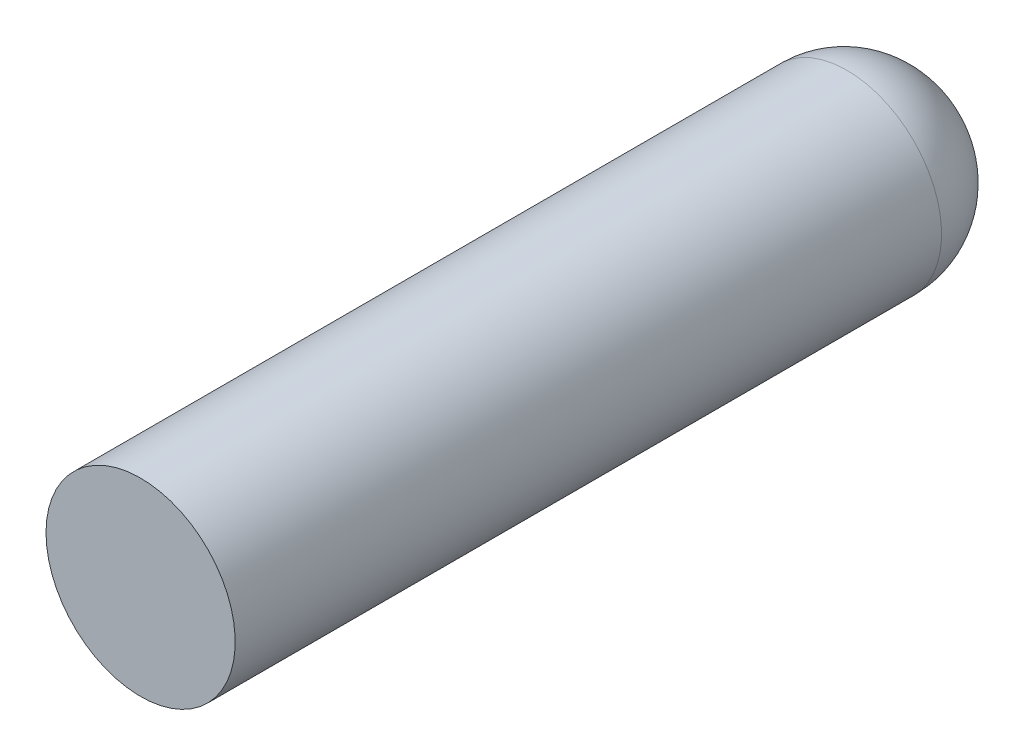
ISO-10303-21;
HEADER;
FILE_DESCRIPTION(('STEP AP214'),'2;1');
FILE_NAME('part.step','',(''),(''),'','','');
FILE_SCHEMA(('AUTOMOTIVE_DESIGN { 1 0 10303 214 1 1 1 1 }'));
ENDSEC;
DATA;
#1=APPLICATION_CONTEXT('core data for automotive mechanical design processes');
#2=APPLICATION_PROTOCOL_DEFINITION('international standard','automotive_design',2000,#1);
#3=PRODUCT_CONTEXT('',#1,'mechanical');
#4=PRODUCT('Part','Part','',(#3));
#5=PRODUCT_RELATED_PRODUCT_CATEGORY('part','',(#4));
#6=PRODUCT_DEFINITION_FORMATION('','',#4);
#7=PRODUCT_DEFINITION_CONTEXT('part definition',#1,'design');
#8=PRODUCT_DEFINITION('design','',#6,#7);
#9=PRODUCT_DEFINITION_SHAPE('','',#8);
#10=(LENGTH_UNIT() NAMED_UNIT(*) SI_UNIT(.MILLI.,.METRE.));
#11=(NAMED_UNIT(*) PLANE_ANGLE_UNIT() SI_UNIT($,.RADIAN.));
#12=(NAMED_UNIT(*) SI_UNIT($,.STERADIAN.) SOLID_ANGLE_UNIT());
#13=UNCERTAINTY_MEASURE_WITH_UNIT(LENGTH_MEASURE(1.E-05),#10,'distance_accuracy_value','');
#14=(GEOMETRIC_REPRESENTATION_CONTEXT(3) GLOBAL_UNCERTAINTY_ASSIGNED_CONTEXT((#13)) GLOBAL_UNIT_ASSIGNED_CONTEXT((#10,
#11,#12)) REPRESENTATION_CONTEXT('',''));
#15=CARTESIAN_POINT('',(0.,0.,0.));
#16=DIRECTION('',(0.,0.,1.));
#17=DIRECTION('',(1.,0.,0.));
#18=AXIS2_PLACEMENT_3D('',#15,#16,#17);
#19=CARTESIAN_POINT('',(0.009999999999999,0.,-1.25));
#20=DIRECTION('',(0.,0.,1.));
#21=DIRECTION('',(1.,0.,0.));
#22=AXIS2_PLACEMENT_3D('',#19,#20,#21);
#23=PLANE('',#22);
#24=CARTESIAN_POINT('',(0.,0.,-1.25));
#25=DIRECTION('',(0.,0.,1.));
#26=DIRECTION('',(-1.,0.,0.));
#27=AXIS2_PLACEMENT_3D('',#24,#25,#26);
#28=CIRCLE('',#27,0.009999999999999);
#29=CARTESIAN_POINT('',(-0.009999999999999,0.,-1.25));
#30=VERTEX_POINT('',#29);
#31=CARTESIAN_POINT('',(0.009999999999999,0.,-1.25));
#32=VERTEX_POINT('',#31);
#33=EDGE_CURVE('E35',#30,#32,#28,.T.);
#34=ORIENTED_EDGE('',*,*,#33,.F.);
#35=CARTESIAN_POINT('',(0.,0.,-1.25));
#36=DIRECTION('',(0.,0.,1.));
#37=DIRECTION('',(1.,0.,0.));
#38=AXIS2_PLACEMENT_3D('',#35,#36,#37);
#39=CIRCLE('',#38,0.009999999999999);
#40=EDGE_CURVE('E41',#32,#30,#39,.T.);
#41=ORIENTED_EDGE('',*,*,#40,.F.);
#42=EDGE_LOOP('',(#34,#41));
#43=FACE_BOUND('',#42,.T.);
#44=ADVANCED_FACE('F17',(#43),#23,.F.);
#45=CARTESIAN_POINT('',(0.,0.,0.01));
#46=DIRECTION('',(0.,0.,-1.));
#47=DIRECTION('',(-1.,0.,0.));
#48=AXIS2_PLACEMENT_3D('',#45,#46,#47);
#49=PLANE('',#48);
#50=CARTESIAN_POINT('',(0.,0.,0.01));
#51=DIRECTION('',(0.,0.,-1.));
#52=DIRECTION('',(-1.,0.,0.));
#53=AXIS2_PLACEMENT_3D('',#50,#51,#52);
#54=CIRCLE('',#53,0.15);
#55=CARTESIAN_POINT('',(-0.15,0.,0.01));
#56=VERTEX_POINT('',#55);
#57=EDGE_CURVE('E28',#56,#56,#54,.T.);
#58=ORIENTED_EDGE('',*,*,#57,.F.);
#59=EDGE_LOOP('',(#58));
#60=FACE_BOUND('',#59,.T.);
#61=ADVANCED_FACE('F69',(#60),#49,.F.);
#62=CARTESIAN_POINT('',(-0.15,0.,-1.11));
#63=CARTESIAN_POINT('',(-0.15,0.,-1.146651914292));
#64=CARTESIAN_POINT('',(-0.138488123957,0.,-1.183300710099));
#65=CARTESIAN_POINT('',(-0.11544662095,0.,-1.21544662095));
#66=CARTESIAN_POINT('',(-0.08330071009872,0.,-1.238488123957));
#67=CARTESIAN_POINT('',(-0.04665191429188,0.,-1.25));
#68=CARTESIAN_POINT('',(-0.009999999999999,0.,-1.25));
#69=(BOUNDED_CURVE() B_SPLINE_CURVE(6,(#62,#63,#64,#65,#66,#67,#68),.UNSPECIFIED.,.F.,
.F.) B_SPLINE_CURVE_WITH_KNOTS((7,7),(0.,1.570796326795),
.UNSPECIFIED.) CURVE() GEOMETRIC_REPRESENTATION_ITEM() RATIONAL_B_SPLINE_CURVE((1.,1.,1.,1.,1.,
1.,1.)) REPRESENTATION_ITEM(''));
#70=CARTESIAN_POINT('',(0.,0.,-1.11));
#71=DIRECTION('',(0.,0.,1.));
#72=AXIS1_PLACEMENT('',#70,#71);
#73=SURFACE_OF_REVOLUTION('',#69,#72);
#74=ORIENTED_EDGE('',*,*,#33,.T.);
#75=ORIENTED_EDGE('',*,*,#40,.T.);
#76=EDGE_LOOP('',(#74,#75));
#77=FACE_BOUND('',#76,.T.);
#78=CARTESIAN_POINT('',(0.,0.,-1.11));
#79=DIRECTION('',(0.,0.,-1.));
#80=DIRECTION('',(-1.,0.,0.));
#81=AXIS2_PLACEMENT_3D('',#78,#79,#80);
#82=CIRCLE('',#81,0.15);
#83=CARTESIAN_POINT('',(-0.15,0.,-1.11));
#84=VERTEX_POINT('',#83);
#85=EDGE_CURVE('E11',#84,#84,#82,.F.);
#86=ORIENTED_EDGE('',*,*,#85,.F.);
#87=EDGE_LOOP('',(#86));
#88=FACE_BOUND('',#87,.T.);
#89=ADVANCED_FACE('F39',(#77,#88),#73,.F.);
#90=CARTESIAN_POINT('',(0.,0.,-1.5));
#91=DIRECTION('',(0.,0.,-1.));
#92=DIRECTION('',(-1.,0.,0.));
#93=AXIS2_PLACEMENT_3D('',#90,#91,#92);
#94=CYLINDRICAL_SURFACE('',#93,0.15);
#95=ORIENTED_EDGE('',*,*,#85,.T.);
#96=EDGE_LOOP('',(#95));
#97=FACE_BOUND('',#96,.T.);
#98=ORIENTED_EDGE('',*,*,#57,.T.);
#99=EDGE_LOOP('',(#98));
#100=FACE_BOUND('',#99,.T.);
#101=ADVANCED_FACE('F68',(#97,#100),#94,.T.);
#102=CLOSED_SHELL('',(#44,#61,#89,#101));
#103=MANIFOLD_SOLID_BREP('B1',#102);
#104=ADVANCED_BREP_SHAPE_REPRESENTATION('',(#18,#103),#14);
#105=SHAPE_DEFINITION_REPRESENTATION(#9,#104);
ENDSEC;
END-ISO-10303-21;
